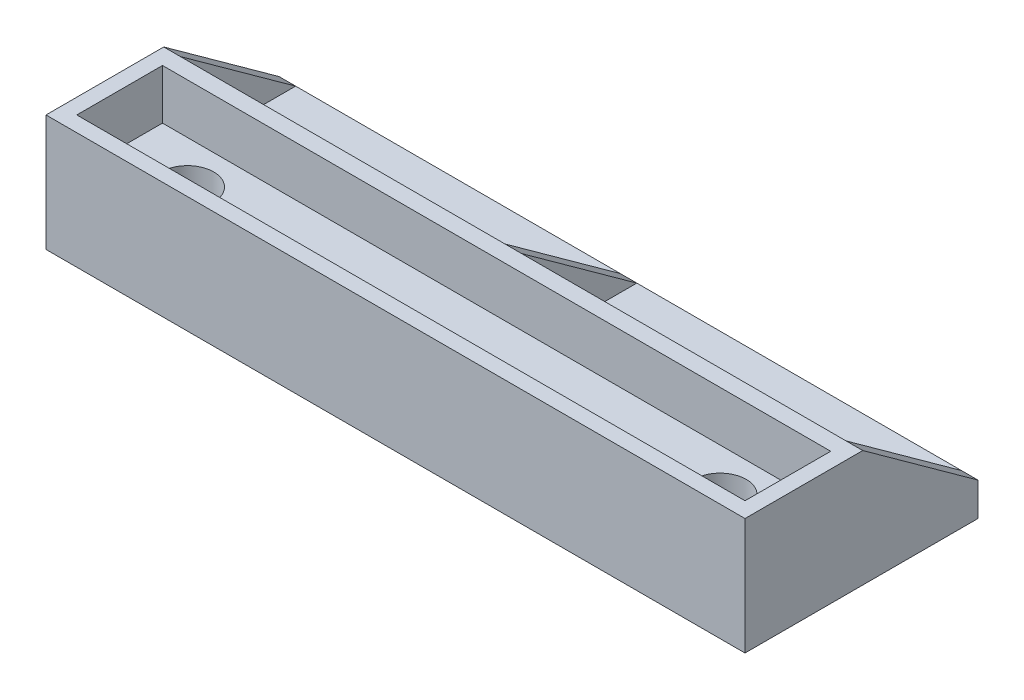
ISO-10303-21;
HEADER;
FILE_DESCRIPTION(('STEP AP214'),'2;1');
FILE_NAME('part.step','',(''),(''),'','','');
FILE_SCHEMA(('AUTOMOTIVE_DESIGN { 1 0 10303 214 1 1 1 1 }'));
ENDSEC;
DATA;
#1=APPLICATION_CONTEXT('core data for automotive mechanical design processes');
#2=APPLICATION_PROTOCOL_DEFINITION('international standard','automotive_design',2000,#1);
#3=PRODUCT_CONTEXT('',#1,'mechanical');
#4=PRODUCT('Part','Part','',(#3));
#5=PRODUCT_RELATED_PRODUCT_CATEGORY('part','',(#4));
#6=PRODUCT_DEFINITION_FORMATION('','',#4);
#7=PRODUCT_DEFINITION_CONTEXT('part definition',#1,'design');
#8=PRODUCT_DEFINITION('design','',#6,#7);
#9=PRODUCT_DEFINITION_SHAPE('','',#8);
#10=(LENGTH_UNIT() NAMED_UNIT(*) SI_UNIT(.MILLI.,.METRE.));
#11=(NAMED_UNIT(*) PLANE_ANGLE_UNIT() SI_UNIT($,.RADIAN.));
#12=(NAMED_UNIT(*) SI_UNIT($,.STERADIAN.) SOLID_ANGLE_UNIT());
#13=UNCERTAINTY_MEASURE_WITH_UNIT(LENGTH_MEASURE(1.E-05),#10,'distance_accuracy_value','');
#14=(GEOMETRIC_REPRESENTATION_CONTEXT(3) GLOBAL_UNCERTAINTY_ASSIGNED_CONTEXT((#13)) GLOBAL_UNIT_ASSIGNED_CONTEXT((#10,
#11,#12)) REPRESENTATION_CONTEXT('',''));
#15=CARTESIAN_POINT('',(0.,0.,0.));
#16=DIRECTION('',(0.,0.,1.));
#17=DIRECTION('',(1.,0.,0.));
#18=AXIS2_PLACEMENT_3D('',#15,#16,#17);
#19=CARTESIAN_POINT('',(5.,7.,-3.49999999993633));
#20=DIRECTION('',(0.,-1.,0.));
#21=DIRECTION('',(0.,0.,-1.));
#22=AXIS2_PLACEMENT_3D('',#19,#20,#21);
#23=CYLINDRICAL_SURFACE('',#22,1.575);
#24=CARTESIAN_POINT('',(5.,0.,-3.49999999993633));
#25=DIRECTION('',(0.,-1.,0.));
#26=DIRECTION('',(0.,0.,1.));
#27=AXIS2_PLACEMENT_3D('',#24,#25,#26);
#28=CIRCLE('',#27,1.575);
#29=CARTESIAN_POINT('',(5.,0.,-1.92499999993633));
#30=VERTEX_POINT('',#29);
#31=EDGE_CURVE('E250',#30,#30,#28,.T.);
#32=ORIENTED_EDGE('',*,*,#31,.T.);
#33=EDGE_LOOP('',(#32));
#34=FACE_BOUND('',#33,.T.);
#35=CARTESIAN_POINT('',(5.,4.,-3.49999999993633));
#36=DIRECTION('',(0.,1.,0.));
#37=DIRECTION('',(0.,0.,1.));
#38=AXIS2_PLACEMENT_3D('',#35,#36,#37);
#39=CIRCLE('',#38,1.575);
#40=CARTESIAN_POINT('',(5.,4.,-1.92499999993633));
#41=VERTEX_POINT('',#40);
#42=EDGE_CURVE('E246',#41,#41,#39,.F.);
#43=ORIENTED_EDGE('',*,*,#42,.F.);
#44=EDGE_LOOP('',(#43));
#45=FACE_BOUND('',#44,.T.);
#46=ADVANCED_FACE('F45',(#34,#45),#23,.F.);
#47=CARTESIAN_POINT('',(37.,7.,-3.49999999993633));
#48=DIRECTION('',(0.,-1.,0.));
#49=DIRECTION('',(0.,0.,-1.));
#50=AXIS2_PLACEMENT_3D('',#47,#48,#49);
#51=CYLINDRICAL_SURFACE('',#50,1.575);
#52=CARTESIAN_POINT('',(37.,0.,-3.49999999993633));
#53=DIRECTION('',(0.,-1.,0.));
#54=DIRECTION('',(0.,0.,-1.));
#55=AXIS2_PLACEMENT_3D('',#52,#53,#54);
#56=CIRCLE('',#55,1.575);
#57=CARTESIAN_POINT('',(37.,0.,-5.07499999993633));
#58=VERTEX_POINT('',#57);
#59=EDGE_CURVE('E251',#58,#58,#56,.T.);
#60=ORIENTED_EDGE('',*,*,#59,.T.);
#61=EDGE_LOOP('',(#60));
#62=FACE_BOUND('',#61,.T.);
#63=CARTESIAN_POINT('',(37.,4.,-3.49999999993633));
#64=DIRECTION('',(0.,1.,0.));
#65=DIRECTION('',(0.,0.,1.));
#66=AXIS2_PLACEMENT_3D('',#63,#64,#65);
#67=CIRCLE('',#66,1.575);
#68=CARTESIAN_POINT('',(37.,4.,-1.92499999993633));
#69=VERTEX_POINT('',#68);
#70=EDGE_CURVE('E236',#69,#69,#67,.F.);
#71=ORIENTED_EDGE('',*,*,#70,.F.);
#72=EDGE_LOOP('',(#71));
#73=FACE_BOUND('',#72,.T.);
#74=ADVANCED_FACE('F414',(#62,#73),#51,.F.);
#75=CARTESIAN_POINT('',(42.,7.,-6.99999999987266));
#76=DIRECTION('',(-1.,0.,0.));
#77=DIRECTION('',(0.,0.,1.));
#78=AXIS2_PLACEMENT_3D('',#75,#76,#77);
#79=PLANE('',#78);
#80=DIRECTION('',(0.,-1.,0.));
#81=VECTOR('',#80,1.);
#82=CARTESIAN_POINT('',(42.,7.,-13.9999999998727));
#83=LINE('',#82,#81);
#84=CARTESIAN_POINT('',(42.,2.,-13.9999999998727));
#85=VERTEX_POINT('',#84);
#86=CARTESIAN_POINT('',(42.,0.,-13.9999999998727));
#87=VERTEX_POINT('',#86);
#88=EDGE_CURVE('E194',#85,#87,#83,.T.);
#89=ORIENTED_EDGE('',*,*,#88,.F.);
#90=DIRECTION('',(0.,0.585383683581828,0.810756401760831));
#91=VECTOR('',#90,1.);
#92=CARTESIAN_POINT('',(42.,7.,-7.07499999987266));
#93=LINE('',#92,#91);
#94=CARTESIAN_POINT('',(42.,7.,-7.07499999987266));
#95=VERTEX_POINT('',#94);
#96=EDGE_CURVE('E177',#85,#95,#93,.T.);
#97=ORIENTED_EDGE('',*,*,#96,.T.);
#98=DIRECTION('',(0.,0.,-1.));
#99=VECTOR('',#98,1.);
#100=CARTESIAN_POINT('',(42.,7.,-6.99999999987266));
#101=LINE('',#100,#99);
#102=CARTESIAN_POINT('',(42.,7.,0.));
#103=VERTEX_POINT('',#102);
#104=EDGE_CURVE('E259',#103,#95,#101,.T.);
#105=ORIENTED_EDGE('',*,*,#104,.F.);
#106=DIRECTION('',(0.,-1.,0.));
#107=VECTOR('',#106,1.);
#108=CARTESIAN_POINT('',(42.,7.,0.));
#109=LINE('',#108,#107);
#110=CARTESIAN_POINT('',(42.,0.,0.));
#111=VERTEX_POINT('',#110);
#112=EDGE_CURVE('E269',#103,#111,#109,.T.);
#113=ORIENTED_EDGE('',*,*,#112,.T.);
#114=DIRECTION('',(0.,0.,-1.));
#115=VECTOR('',#114,1.);
#116=CARTESIAN_POINT('',(42.,0.,-6.99999999987266));
#117=LINE('',#116,#115);
#118=EDGE_CURVE('E255',#111,#87,#117,.T.);
#119=ORIENTED_EDGE('',*,*,#118,.T.);
#120=EDGE_LOOP('',(#89,#97,#105,#113,#119));
#121=FACE_BOUND('',#120,.T.);
#122=ADVANCED_FACE('F383',(#121),#79,.F.);
#123=CARTESIAN_POINT('',(0.,7.,-6.99999999987266));
#124=DIRECTION('',(1.,0.,0.));
#125=DIRECTION('',(0.,0.,-1.));
#126=AXIS2_PLACEMENT_3D('',#123,#124,#125);
#127=PLANE('',#126);
#128=DIRECTION('',(0.,0.,1.));
#129=VECTOR('',#128,1.);
#130=CARTESIAN_POINT('',(0.,7.,-6.99999999987266));
#131=LINE('',#130,#129);
#132=CARTESIAN_POINT('',(0.,7.,-7.07499999987266));
#133=VERTEX_POINT('',#132);
#134=CARTESIAN_POINT('',(0.,7.,0.));
#135=VERTEX_POINT('',#134);
#136=EDGE_CURVE('E186',#133,#135,#131,.T.);
#137=ORIENTED_EDGE('',*,*,#136,.F.);
#138=DIRECTION('',(0.,0.585383683581828,0.810756401760831));
#139=VECTOR('',#138,1.);
#140=CARTESIAN_POINT('',(0.,7.,-7.07499999987266));
#141=LINE('',#140,#139);
#142=CARTESIAN_POINT('',(0.,2.,-13.9999999998727));
#143=VERTEX_POINT('',#142);
#144=EDGE_CURVE('E167',#143,#133,#141,.T.);
#145=ORIENTED_EDGE('',*,*,#144,.F.);
#146=DIRECTION('',(0.,-1.,0.));
#147=VECTOR('',#146,1.);
#148=CARTESIAN_POINT('',(0.,7.,-13.9999999998727));
#149=LINE('',#148,#147);
#150=CARTESIAN_POINT('',(0.,0.,-13.9999999998727));
#151=VERTEX_POINT('',#150);
#152=EDGE_CURVE('E183',#143,#151,#149,.T.);
#153=ORIENTED_EDGE('',*,*,#152,.T.);
#154=DIRECTION('',(0.,0.,1.));
#155=VECTOR('',#154,1.);
#156=CARTESIAN_POINT('',(0.,0.,-6.99999999987266));
#157=LINE('',#156,#155);
#158=CARTESIAN_POINT('',(0.,0.,0.));
#159=VERTEX_POINT('',#158);
#160=EDGE_CURVE('E273',#151,#159,#157,.T.);
#161=ORIENTED_EDGE('',*,*,#160,.T.);
#162=DIRECTION('',(0.,-1.,0.));
#163=VECTOR('',#162,1.);
#164=CARTESIAN_POINT('',(0.,7.,0.));
#165=LINE('',#164,#163);
#166=EDGE_CURVE('E281',#135,#159,#165,.T.);
#167=ORIENTED_EDGE('',*,*,#166,.F.);
#168=EDGE_LOOP('',(#137,#145,#153,#161,#167));
#169=FACE_BOUND('',#168,.T.);
#170=ADVANCED_FACE('F182',(#169),#127,.F.);
#171=CARTESIAN_POINT('',(0.,7.,0.));
#172=DIRECTION('',(0.,0.,-1.));
#173=DIRECTION('',(-1.,0.,0.));
#174=AXIS2_PLACEMENT_3D('',#171,#172,#173);
#175=PLANE('',#174);
#176=DIRECTION('',(1.,0.,0.));
#177=VECTOR('',#176,1.);
#178=CARTESIAN_POINT('',(0.,0.,0.));
#179=LINE('',#178,#177);
#180=EDGE_CURVE('E263',#159,#111,#179,.T.);
#181=ORIENTED_EDGE('',*,*,#180,.T.);
#182=ORIENTED_EDGE('',*,*,#112,.F.);
#183=DIRECTION('',(1.,0.,0.));
#184=VECTOR('',#183,1.);
#185=CARTESIAN_POINT('',(0.,7.,0.));
#186=LINE('',#185,#184);
#187=EDGE_CURVE('E266',#135,#103,#186,.T.);
#188=ORIENTED_EDGE('',*,*,#187,.F.);
#189=ORIENTED_EDGE('',*,*,#166,.T.);
#190=EDGE_LOOP('',(#181,#182,#188,#189));
#191=FACE_BOUND('',#190,.T.);
#192=ADVANCED_FACE('F393',(#191),#175,.F.);
#193=CARTESIAN_POINT('',(0.,7.,0.));
#194=DIRECTION('',(0.,1.,0.));
#195=DIRECTION('',(0.,0.,1.));
#196=AXIS2_PLACEMENT_3D('',#193,#194,#195);
#197=PLANE('',#196);
#198=DIRECTION('',(-1.,0.,0.));
#199=VECTOR('',#198,1.);
#200=CARTESIAN_POINT('',(42.,7.,-7.07499999987266));
#201=LINE('',#200,#199);
#202=CARTESIAN_POINT('',(1.,7.,-7.07499999987266));
#203=VERTEX_POINT('',#202);
#204=EDGE_CURVE('E373',#203,#133,#201,.T.);
#205=ORIENTED_EDGE('',*,*,#204,.T.);
#206=ORIENTED_EDGE('',*,*,#136,.T.);
#207=ORIENTED_EDGE('',*,*,#187,.T.);
#208=ORIENTED_EDGE('',*,*,#104,.T.);
#209=CARTESIAN_POINT('',(41.,7.,-7.07499999987266));
#210=VERTEX_POINT('',#209);
#211=EDGE_CURVE('E370',#95,#210,#201,.T.);
#212=ORIENTED_EDGE('',*,*,#211,.T.);
#213=DIRECTION('',(1.,0.,0.));
#214=VECTOR('',#213,1.);
#215=CARTESIAN_POINT('',(21.5,7.,-7.07499999987266));
#216=LINE('',#215,#214);
#217=CARTESIAN_POINT('',(21.5,7.,-7.07499999987266));
#218=VERTEX_POINT('',#217);
#219=EDGE_CURVE('E328',#218,#210,#216,.T.);
#220=ORIENTED_EDGE('',*,*,#219,.F.);
#221=CARTESIAN_POINT('',(20.5,7.,-7.07499999987266));
#222=VERTEX_POINT('',#221);
#223=EDGE_CURVE('E377',#218,#222,#201,.T.);
#224=ORIENTED_EDGE('',*,*,#223,.T.);
#225=DIRECTION('',(1.,0.,0.));
#226=VECTOR('',#225,1.);
#227=CARTESIAN_POINT('',(20.5,7.,-7.07499999987266));
#228=LINE('',#227,#226);
#229=EDGE_CURVE('E335',#203,#222,#228,.T.);
#230=ORIENTED_EDGE('',*,*,#229,.F.);
#231=EDGE_LOOP('',(#205,#206,#207,#208,#212,#220,#224,#230));
#232=FACE_BOUND('',#231,.T.);
#233=DIRECTION('',(0.,0.,1.));
#234=VECTOR('',#233,1.);
#235=CARTESIAN_POINT('',(0.925,7.,-6.07499999987266));
#236=LINE('',#235,#234);
#237=CARTESIAN_POINT('',(0.925,7.,-6.07499999987266));
#238=VERTEX_POINT('',#237);
#239=CARTESIAN_POINT('',(0.925000000000001,7.,-0.924999999872661));
#240=VERTEX_POINT('',#239);
#241=EDGE_CURVE('E198',#238,#240,#236,.T.);
#242=ORIENTED_EDGE('',*,*,#241,.F.);
#243=DIRECTION('',(1.,0.,0.));
#244=VECTOR('',#243,1.);
#245=CARTESIAN_POINT('',(0.925,7.,-6.07499999987266));
#246=LINE('',#245,#244);
#247=CARTESIAN_POINT('',(41.075,7.,-6.07499999987266));
#248=VERTEX_POINT('',#247);
#249=EDGE_CURVE('E209',#238,#248,#246,.T.);
#250=ORIENTED_EDGE('',*,*,#249,.T.);
#251=DIRECTION('',(0.,0.,1.));
#252=VECTOR('',#251,1.);
#253=CARTESIAN_POINT('',(41.075,7.,-6.07499999987266));
#254=LINE('',#253,#252);
#255=CARTESIAN_POINT('',(41.075,7.,-0.924999999872661));
#256=VERTEX_POINT('',#255);
#257=EDGE_CURVE('E226',#248,#256,#254,.T.);
#258=ORIENTED_EDGE('',*,*,#257,.T.);
#259=DIRECTION('',(1.,0.,0.));
#260=VECTOR('',#259,1.);
#261=CARTESIAN_POINT('',(0.925000000000001,7.,-0.924999999872661));
#262=LINE('',#261,#260);
#263=EDGE_CURVE('E222',#240,#256,#262,.T.);
#264=ORIENTED_EDGE('',*,*,#263,.F.);
#265=EDGE_LOOP('',(#242,#250,#258,#264));
#266=FACE_BOUND('',#265,.T.);
#267=ADVANCED_FACE('F387',(#232,#266),#197,.T.);
#268=CARTESIAN_POINT('',(0.,0.,0.));
#269=DIRECTION('',(0.,1.,0.));
#270=DIRECTION('',(0.,0.,1.));
#271=AXIS2_PLACEMENT_3D('',#268,#269,#270);
#272=PLANE('',#271);
#273=ORIENTED_EDGE('',*,*,#59,.F.);
#274=EDGE_LOOP('',(#273));
#275=FACE_BOUND('',#274,.T.);
#276=ORIENTED_EDGE('',*,*,#31,.F.);
#277=EDGE_LOOP('',(#276));
#278=FACE_BOUND('',#277,.T.);
#279=ORIENTED_EDGE('',*,*,#118,.F.);
#280=ORIENTED_EDGE('',*,*,#180,.F.);
#281=ORIENTED_EDGE('',*,*,#160,.F.);
#282=DIRECTION('',(-1.,0.,0.));
#283=VECTOR('',#282,1.);
#284=CARTESIAN_POINT('',(42.,0.,-13.9999999998727));
#285=LINE('',#284,#283);
#286=EDGE_CURVE('E192',#87,#151,#285,.T.);
#287=ORIENTED_EDGE('',*,*,#286,.F.);
#288=EDGE_LOOP('',(#279,#280,#281,#287));
#289=FACE_BOUND('',#288,.T.);
#290=ADVANCED_FACE('F397',(#275,#278,#289),#272,.F.);
#291=CARTESIAN_POINT('',(0.,4.,0.));
#292=DIRECTION('',(0.,1.,0.));
#293=DIRECTION('',(0.,0.,1.));
#294=AXIS2_PLACEMENT_3D('',#291,#292,#293);
#295=PLANE('',#294);
#296=DIRECTION('',(0.,0.,1.));
#297=VECTOR('',#296,1.);
#298=CARTESIAN_POINT('',(0.925,4.,-6.07499999987266));
#299=LINE('',#298,#297);
#300=CARTESIAN_POINT('',(0.925,4.,-6.07499999987266));
#301=VERTEX_POINT('',#300);
#302=CARTESIAN_POINT('',(0.925000000000001,4.,-0.924999999872661));
#303=VERTEX_POINT('',#302);
#304=EDGE_CURVE('E204',#301,#303,#299,.T.);
#305=ORIENTED_EDGE('',*,*,#304,.T.);
#306=DIRECTION('',(1.,0.,0.));
#307=VECTOR('',#306,1.);
#308=CARTESIAN_POINT('',(0.925000000000001,4.,-0.924999999872661));
#309=LINE('',#308,#307);
#310=CARTESIAN_POINT('',(41.075,4.,-0.924999999872661));
#311=VERTEX_POINT('',#310);
#312=EDGE_CURVE('E208',#303,#311,#309,.T.);
#313=ORIENTED_EDGE('',*,*,#312,.T.);
#314=DIRECTION('',(0.,0.,1.));
#315=VECTOR('',#314,1.);
#316=CARTESIAN_POINT('',(41.075,4.,-6.07499999987266));
#317=LINE('',#316,#315);
#318=CARTESIAN_POINT('',(41.075,4.,-6.07499999987266));
#319=VERTEX_POINT('',#318);
#320=EDGE_CURVE('E213',#319,#311,#317,.T.);
#321=ORIENTED_EDGE('',*,*,#320,.F.);
#322=DIRECTION('',(1.,0.,0.));
#323=VECTOR('',#322,1.);
#324=CARTESIAN_POINT('',(0.925,4.,-6.07499999987266));
#325=LINE('',#324,#323);
#326=EDGE_CURVE('E216',#301,#319,#325,.T.);
#327=ORIENTED_EDGE('',*,*,#326,.F.);
#328=EDGE_LOOP('',(#305,#313,#321,#327));
#329=FACE_BOUND('',#328,.T.);
#330=ORIENTED_EDGE('',*,*,#70,.T.);
#331=EDGE_LOOP('',(#330));
#332=FACE_BOUND('',#331,.T.);
#333=ORIENTED_EDGE('',*,*,#42,.T.);
#334=EDGE_LOOP('',(#333));
#335=FACE_BOUND('',#334,.T.);
#336=ADVANCED_FACE('F399',(#329,#332,#335),#295,.T.);
#337=CARTESIAN_POINT('',(0.925,4.,-6.07499999987266));
#338=DIRECTION('',(-1.,0.,0.));
#339=DIRECTION('',(0.,0.,1.));
#340=AXIS2_PLACEMENT_3D('',#337,#338,#339);
#341=PLANE('',#340);
#342=ORIENTED_EDGE('',*,*,#241,.T.);
#343=DIRECTION('',(0.,1.,0.));
#344=VECTOR('',#343,1.);
#345=CARTESIAN_POINT('',(0.925000000000001,4.,-0.924999999872661));
#346=LINE('',#345,#344);
#347=EDGE_CURVE('E219',#303,#240,#346,.T.);
#348=ORIENTED_EDGE('',*,*,#347,.F.);
#349=ORIENTED_EDGE('',*,*,#304,.F.);
#350=DIRECTION('',(0.,1.,0.));
#351=VECTOR('',#350,1.);
#352=CARTESIAN_POINT('',(0.925,4.,-6.07499999987266));
#353=LINE('',#352,#351);
#354=EDGE_CURVE('E233',#301,#238,#353,.T.);
#355=ORIENTED_EDGE('',*,*,#354,.T.);
#356=EDGE_LOOP('',(#342,#348,#349,#355));
#357=FACE_BOUND('',#356,.T.);
#358=ADVANCED_FACE('F406',(#357),#341,.F.);
#359=CARTESIAN_POINT('',(0.925,4.,-6.07499999987266));
#360=DIRECTION('',(0.,0.,1.));
#361=DIRECTION('',(1.,0.,0.));
#362=AXIS2_PLACEMENT_3D('',#359,#360,#361);
#363=PLANE('',#362);
#364=ORIENTED_EDGE('',*,*,#249,.F.);
#365=ORIENTED_EDGE('',*,*,#354,.F.);
#366=ORIENTED_EDGE('',*,*,#326,.T.);
#367=DIRECTION('',(0.,1.,0.));
#368=VECTOR('',#367,1.);
#369=CARTESIAN_POINT('',(41.075,4.,-6.07499999987266));
#370=LINE('',#369,#368);
#371=EDGE_CURVE('E237',#319,#248,#370,.T.);
#372=ORIENTED_EDGE('',*,*,#371,.T.);
#373=EDGE_LOOP('',(#364,#365,#366,#372));
#374=FACE_BOUND('',#373,.T.);
#375=ADVANCED_FACE('F426',(#374),#363,.T.);
#376=CARTESIAN_POINT('',(41.075,4.,-6.07499999987266));
#377=DIRECTION('',(-1.,0.,0.));
#378=DIRECTION('',(0.,0.,1.));
#379=AXIS2_PLACEMENT_3D('',#376,#377,#378);
#380=PLANE('',#379);
#381=ORIENTED_EDGE('',*,*,#257,.F.);
#382=ORIENTED_EDGE('',*,*,#371,.F.);
#383=ORIENTED_EDGE('',*,*,#320,.T.);
#384=DIRECTION('',(0.,1.,0.));
#385=VECTOR('',#384,1.);
#386=CARTESIAN_POINT('',(41.075,4.,-0.924999999872661));
#387=LINE('',#386,#385);
#388=EDGE_CURVE('E240',#311,#256,#387,.T.);
#389=ORIENTED_EDGE('',*,*,#388,.T.);
#390=EDGE_LOOP('',(#381,#382,#383,#389));
#391=FACE_BOUND('',#390,.T.);
#392=ADVANCED_FACE('F431',(#391),#380,.T.);
#393=CARTESIAN_POINT('',(0.925000000000001,4.,-0.924999999872661));
#394=DIRECTION('',(0.,0.,1.));
#395=DIRECTION('',(1.,0.,0.));
#396=AXIS2_PLACEMENT_3D('',#393,#394,#395);
#397=PLANE('',#396);
#398=ORIENTED_EDGE('',*,*,#263,.T.);
#399=ORIENTED_EDGE('',*,*,#388,.F.);
#400=ORIENTED_EDGE('',*,*,#312,.F.);
#401=ORIENTED_EDGE('',*,*,#347,.T.);
#402=EDGE_LOOP('',(#398,#399,#400,#401));
#403=FACE_BOUND('',#402,.T.);
#404=ADVANCED_FACE('F428',(#403),#397,.F.);
#405=CARTESIAN_POINT('',(42.,7.,-13.9999999998727));
#406=DIRECTION('',(0.,0.,1.));
#407=DIRECTION('',(1.,0.,0.));
#408=AXIS2_PLACEMENT_3D('',#405,#406,#407);
#409=PLANE('',#408);
#410=ORIENTED_EDGE('',*,*,#152,.F.);
#411=DIRECTION('',(-1.,0.,0.));
#412=VECTOR('',#411,1.);
#413=CARTESIAN_POINT('',(42.,2.,-13.9999999998727));
#414=LINE('',#413,#412);
#415=CARTESIAN_POINT('',(1.,2.,-13.9999999998727));
#416=VERTEX_POINT('',#415);
#417=EDGE_CURVE('E163',#416,#143,#414,.T.);
#418=ORIENTED_EDGE('',*,*,#417,.F.);
#419=DIRECTION('',(-1.,0.,0.));
#420=VECTOR('',#419,1.);
#421=CARTESIAN_POINT('',(1.,2.,-13.9999999998727));
#422=LINE('',#421,#420);
#423=CARTESIAN_POINT('',(20.5,2.,-13.9999999998727));
#424=VERTEX_POINT('',#423);
#425=EDGE_CURVE('E355',#424,#416,#422,.T.);
#426=ORIENTED_EDGE('',*,*,#425,.F.);
#427=CARTESIAN_POINT('',(21.5,2.,-13.9999999998727));
#428=VERTEX_POINT('',#427);
#429=EDGE_CURVE('E176',#428,#424,#414,.T.);
#430=ORIENTED_EDGE('',*,*,#429,.F.);
#431=DIRECTION('',(-1.,0.,0.));
#432=VECTOR('',#431,1.);
#433=CARTESIAN_POINT('',(21.5,2.,-13.9999999998727));
#434=LINE('',#433,#432);
#435=CARTESIAN_POINT('',(41.,2.,-13.9999999998727));
#436=VERTEX_POINT('',#435);
#437=EDGE_CURVE('E324',#436,#428,#434,.T.);
#438=ORIENTED_EDGE('',*,*,#437,.F.);
#439=EDGE_CURVE('E179',#85,#436,#414,.T.);
#440=ORIENTED_EDGE('',*,*,#439,.F.);
#441=ORIENTED_EDGE('',*,*,#88,.T.);
#442=ORIENTED_EDGE('',*,*,#286,.T.);
#443=EDGE_LOOP('',(#410,#418,#426,#430,#438,#440,#441,#442));
#444=FACE_BOUND('',#443,.T.);
#445=ADVANCED_FACE('F190',(#444),#409,.F.);
#446=CARTESIAN_POINT('',(21.5,2.,-13.9999999998727));
#447=DIRECTION('',(-1.,0.,0.));
#448=DIRECTION('',(0.,0.,1.));
#449=AXIS2_PLACEMENT_3D('',#446,#447,#448);
#450=PLANE('',#449);
#451=DIRECTION('',(0.,1.,0.));
#452=VECTOR('',#451,1.);
#453=CARTESIAN_POINT('',(21.5,2.,-7.07499999987266));
#454=LINE('',#453,#452);
#455=CARTESIAN_POINT('',(21.5,2.99999999999999,-7.07499999987266));
#456=VERTEX_POINT('',#455);
#457=EDGE_CURVE('E329',#456,#218,#454,.T.);
#458=ORIENTED_EDGE('',*,*,#457,.F.);
#459=DIRECTION('',(0.,-0.707106781186543,-0.707106781186552));
#460=VECTOR('',#459,1.);
#461=CARTESIAN_POINT('',(21.5,2.,-8.07499999987267));
#462=LINE('',#461,#460);
#463=CARTESIAN_POINT('',(21.5,2.,-8.07499999987267));
#464=VERTEX_POINT('',#463);
#465=EDGE_CURVE('E11',#456,#464,#462,.T.);
#466=ORIENTED_EDGE('',*,*,#465,.T.);
#467=DIRECTION('',(0.,0.,1.));
#468=VECTOR('',#467,1.);
#469=CARTESIAN_POINT('',(21.5,2.,-13.9999999998727));
#470=LINE('',#469,#468);
#471=EDGE_CURVE('E315',#428,#464,#470,.T.);
#472=ORIENTED_EDGE('',*,*,#471,.F.);
#473=DIRECTION('',(0.,0.585383683581828,0.810756401760831));
#474=VECTOR('',#473,1.);
#475=CARTESIAN_POINT('',(21.5,2.,-13.9999999998727));
#476=LINE('',#475,#474);
#477=EDGE_CURVE('E339',#428,#218,#476,.T.);
#478=ORIENTED_EDGE('',*,*,#477,.T.);
#479=EDGE_LOOP('',(#458,#466,#472,#478));
#480=FACE_BOUND('',#479,.T.);
#481=ADVANCED_FACE('F441',(#480),#450,.F.);
#482=CARTESIAN_POINT('',(41.,2.,-13.9999999998727));
#483=DIRECTION('',(1.,0.,0.));
#484=DIRECTION('',(0.,0.,-1.));
#485=AXIS2_PLACEMENT_3D('',#482,#483,#484);
#486=PLANE('',#485);
#487=DIRECTION('',(0.,0.,-1.));
#488=VECTOR('',#487,1.);
#489=CARTESIAN_POINT('',(41.,2.,-13.9999999998727));
#490=LINE('',#489,#488);
#491=CARTESIAN_POINT('',(41.,2.,-8.07499999987267));
#492=VERTEX_POINT('',#491);
#493=EDGE_CURVE('E312',#492,#436,#490,.T.);
#494=ORIENTED_EDGE('',*,*,#493,.F.);
#495=DIRECTION('',(0.,0.707106781186543,0.707106781186552));
#496=VECTOR('',#495,1.);
#497=CARTESIAN_POINT('',(41.,2.,-8.07499999987267));
#498=LINE('',#497,#496);
#499=CARTESIAN_POINT('',(41.,2.99999999999999,-7.07499999987266));
#500=VERTEX_POINT('',#499);
#501=EDGE_CURVE('E69',#492,#500,#498,.T.);
#502=ORIENTED_EDGE('',*,*,#501,.T.);
#503=DIRECTION('',(0.,1.,0.));
#504=VECTOR('',#503,1.);
#505=CARTESIAN_POINT('',(41.,2.,-7.07499999987266));
#506=LINE('',#505,#504);
#507=EDGE_CURVE('E336',#500,#210,#506,.T.);
#508=ORIENTED_EDGE('',*,*,#507,.T.);
#509=DIRECTION('',(0.,-0.585383683581828,-0.810756401760831));
#510=VECTOR('',#509,1.);
#511=CARTESIAN_POINT('',(41.,2.,-13.9999999998727));
#512=LINE('',#511,#510);
#513=EDGE_CURVE('E321',#210,#436,#512,.T.);
#514=ORIENTED_EDGE('',*,*,#513,.T.);
#515=EDGE_LOOP('',(#494,#502,#508,#514));
#516=FACE_BOUND('',#515,.T.);
#517=ADVANCED_FACE('F319',(#516),#486,.F.);
#518=CARTESIAN_POINT('',(21.5,2.,-7.07499999987266));
#519=DIRECTION('',(0.,0.,1.));
#520=DIRECTION('',(1.,0.,0.));
#521=AXIS2_PLACEMENT_3D('',#518,#519,#520);
#522=PLANE('',#521);
#523=ORIENTED_EDGE('',*,*,#507,.F.);
#524=DIRECTION('',(-1.,0.,0.));
#525=VECTOR('',#524,1.);
#526=CARTESIAN_POINT('',(21.5,2.99999999999999,-7.07499999987266));
#527=LINE('',#526,#525);
#528=EDGE_CURVE('E55',#500,#456,#527,.T.);
#529=ORIENTED_EDGE('',*,*,#528,.T.);
#530=ORIENTED_EDGE('',*,*,#457,.T.);
#531=ORIENTED_EDGE('',*,*,#219,.T.);
#532=EDGE_LOOP('',(#523,#529,#530,#531));
#533=FACE_BOUND('',#532,.T.);
#534=ADVANCED_FACE('F445',(#533),#522,.F.);
#535=CARTESIAN_POINT('',(0.,2.,0.));
#536=DIRECTION('',(0.,1.,0.));
#537=DIRECTION('',(0.,0.,1.));
#538=AXIS2_PLACEMENT_3D('',#535,#536,#537);
#539=PLANE('',#538);
#540=ORIENTED_EDGE('',*,*,#471,.T.);
#541=DIRECTION('',(1.,0.,0.));
#542=VECTOR('',#541,1.);
#543=CARTESIAN_POINT('',(0.,2.,-8.07499999987267));
#544=LINE('',#543,#542);
#545=EDGE_CURVE('E301',#464,#492,#544,.T.);
#546=ORIENTED_EDGE('',*,*,#545,.T.);
#547=ORIENTED_EDGE('',*,*,#493,.T.);
#548=ORIENTED_EDGE('',*,*,#437,.T.);
#549=EDGE_LOOP('',(#540,#546,#547,#548));
#550=FACE_BOUND('',#549,.T.);
#551=ADVANCED_FACE('F310',(#550),#539,.T.);
#552=CARTESIAN_POINT('',(20.5,2.,-7.07499999987266));
#553=DIRECTION('',(0.,0.,1.));
#554=DIRECTION('',(1.,0.,0.));
#555=AXIS2_PLACEMENT_3D('',#552,#553,#554);
#556=PLANE('',#555);
#557=DIRECTION('',(0.,1.,0.));
#558=VECTOR('',#557,1.);
#559=CARTESIAN_POINT('',(20.5,2.,-7.07499999987266));
#560=LINE('',#559,#558);
#561=CARTESIAN_POINT('',(20.5,2.99999999999999,-7.07499999987266));
#562=VERTEX_POINT('',#561);
#563=EDGE_CURVE('E342',#562,#222,#560,.T.);
#564=ORIENTED_EDGE('',*,*,#563,.F.);
#565=DIRECTION('',(-1.,0.,0.));
#566=VECTOR('',#565,1.);
#567=CARTESIAN_POINT('',(1.,2.99999999999999,-7.07499999987266));
#568=LINE('',#567,#566);
#569=CARTESIAN_POINT('',(1.,2.99999999999999,-7.07499999987266));
#570=VERTEX_POINT('',#569);
#571=EDGE_CURVE('E295',#562,#570,#568,.T.);
#572=ORIENTED_EDGE('',*,*,#571,.T.);
#573=DIRECTION('',(0.,1.,0.));
#574=VECTOR('',#573,1.);
#575=CARTESIAN_POINT('',(1.,2.,-7.07499999987266));
#576=LINE('',#575,#574);
#577=EDGE_CURVE('E200',#570,#203,#576,.T.);
#578=ORIENTED_EDGE('',*,*,#577,.T.);
#579=ORIENTED_EDGE('',*,*,#229,.T.);
#580=EDGE_LOOP('',(#564,#572,#578,#579));
#581=FACE_BOUND('',#580,.T.);
#582=ADVANCED_FACE('F444',(#581),#556,.F.);
#583=CARTESIAN_POINT('',(1.,2.,-7.07499999987266));
#584=DIRECTION('',(-1.,0.,0.));
#585=DIRECTION('',(0.,0.,1.));
#586=AXIS2_PLACEMENT_3D('',#583,#584,#585);
#587=PLANE('',#586);
#588=ORIENTED_EDGE('',*,*,#577,.F.);
#589=DIRECTION('',(0.,0.707106781186543,0.707106781186552));
#590=VECTOR('',#589,1.);
#591=CARTESIAN_POINT('',(1.,2.,-8.07499999987266));
#592=LINE('',#591,#590);
#593=CARTESIAN_POINT('',(1.,2.,-8.07499999987266));
#594=VERTEX_POINT('',#593);
#595=EDGE_CURVE('E298',#570,#594,#592,.F.);
#596=ORIENTED_EDGE('',*,*,#595,.T.);
#597=DIRECTION('',(0.,0.,1.));
#598=VECTOR('',#597,1.);
#599=CARTESIAN_POINT('',(1.,2.,-7.07499999987266));
#600=LINE('',#599,#598);
#601=EDGE_CURVE('E345',#416,#594,#600,.T.);
#602=ORIENTED_EDGE('',*,*,#601,.F.);
#603=DIRECTION('',(0.,0.585383683581828,0.810756401760831));
#604=VECTOR('',#603,1.);
#605=CARTESIAN_POINT('',(1.,5.28662971498086,-9.44801784462418));
#606=LINE('',#605,#604);
#607=EDGE_CURVE('E170',#416,#203,#606,.T.);
#608=ORIENTED_EDGE('',*,*,#607,.T.);
#609=EDGE_LOOP('',(#588,#596,#602,#608));
#610=FACE_BOUND('',#609,.T.);
#611=ADVANCED_FACE('F455',(#610),#587,.F.);
#612=CARTESIAN_POINT('',(20.5,2.,-13.9999999998727));
#613=DIRECTION('',(1.,0.,0.));
#614=DIRECTION('',(0.,0.,-1.));
#615=AXIS2_PLACEMENT_3D('',#612,#613,#614);
#616=PLANE('',#615);
#617=DIRECTION('',(0.,0.,-1.));
#618=VECTOR('',#617,1.);
#619=CARTESIAN_POINT('',(20.5,2.,-13.9999999998727));
#620=LINE('',#619,#618);
#621=CARTESIAN_POINT('',(20.5,2.,-8.07499999987267));
#622=VERTEX_POINT('',#621);
#623=EDGE_CURVE('E351',#622,#424,#620,.T.);
#624=ORIENTED_EDGE('',*,*,#623,.F.);
#625=DIRECTION('',(0.,-0.707106781186543,-0.707106781186552));
#626=VECTOR('',#625,1.);
#627=CARTESIAN_POINT('',(20.5,2.,-8.07499999987267));
#628=LINE('',#627,#626);
#629=EDGE_CURVE('E292',#622,#562,#628,.F.);
#630=ORIENTED_EDGE('',*,*,#629,.T.);
#631=ORIENTED_EDGE('',*,*,#563,.T.);
#632=DIRECTION('',(0.,-0.585383683581828,-0.810756401760831));
#633=VECTOR('',#632,1.);
#634=CARTESIAN_POINT('',(20.5,2.,-13.9999999998727));
#635=LINE('',#634,#633);
#636=EDGE_CURVE('E367',#222,#424,#635,.T.);
#637=ORIENTED_EDGE('',*,*,#636,.T.);
#638=EDGE_LOOP('',(#624,#630,#631,#637));
#639=FACE_BOUND('',#638,.T.);
#640=ADVANCED_FACE('F457',(#639),#616,.F.);
#641=CARTESIAN_POINT('',(0.,2.,0.));
#642=DIRECTION('',(0.,-1.,0.));
#643=DIRECTION('',(0.,0.,-1.));
#644=AXIS2_PLACEMENT_3D('',#641,#642,#643);
#645=PLANE('',#644);
#646=ORIENTED_EDGE('',*,*,#601,.T.);
#647=DIRECTION('',(1.,0.,0.));
#648=VECTOR('',#647,1.);
#649=CARTESIAN_POINT('',(20.5,2.,-8.07499999987267));
#650=LINE('',#649,#648);
#651=EDGE_CURVE('E285',#594,#622,#650,.T.);
#652=ORIENTED_EDGE('',*,*,#651,.T.);
#653=ORIENTED_EDGE('',*,*,#623,.T.);
#654=ORIENTED_EDGE('',*,*,#425,.T.);
#655=EDGE_LOOP('',(#646,#652,#653,#654));
#656=FACE_BOUND('',#655,.T.);
#657=ADVANCED_FACE('F460',(#656),#645,.F.);
#658=CARTESIAN_POINT('',(42.,7.,-7.07499999987266));
#659=DIRECTION('',(0.,-0.810756401760831,0.585383683581828));
#660=DIRECTION('',(0.,-0.585383683581828,-0.810756401760831));
#661=AXIS2_PLACEMENT_3D('',#658,#659,#660);
#662=PLANE('',#661);
#663=ORIENTED_EDGE('',*,*,#429,.T.);
#664=ORIENTED_EDGE('',*,*,#636,.F.);
#665=ORIENTED_EDGE('',*,*,#223,.F.);
#666=ORIENTED_EDGE('',*,*,#477,.F.);
#667=EDGE_LOOP('',(#663,#664,#665,#666));
#668=FACE_BOUND('',#667,.T.);
#669=ADVANCED_FACE('F467',(#668),#662,.F.);
#670=ORIENTED_EDGE('',*,*,#417,.T.);
#671=ORIENTED_EDGE('',*,*,#144,.T.);
#672=ORIENTED_EDGE('',*,*,#204,.F.);
#673=ORIENTED_EDGE('',*,*,#607,.F.);
#674=EDGE_LOOP('',(#670,#671,#672,#673));
#675=FACE_BOUND('',#674,.T.);
#676=ADVANCED_FACE('F165',(#675),#662,.F.);
#677=ORIENTED_EDGE('',*,*,#211,.F.);
#678=ORIENTED_EDGE('',*,*,#96,.F.);
#679=ORIENTED_EDGE('',*,*,#439,.T.);
#680=ORIENTED_EDGE('',*,*,#513,.F.);
#681=EDGE_LOOP('',(#677,#678,#679,#680));
#682=FACE_BOUND('',#681,.T.);
#683=ADVANCED_FACE('F471',(#682),#662,.F.);
#684=CARTESIAN_POINT('',(0.,2.,-8.07499999987266));
#685=DIRECTION('',(0.,0.707106781186552,-0.707106781186543));
#686=DIRECTION('',(-1.,0.,0.));
#687=AXIS2_PLACEMENT_3D('',#684,#685,#686);
#688=PLANE('',#687);
#689=ORIENTED_EDGE('',*,*,#595,.F.);
#690=ORIENTED_EDGE('',*,*,#571,.F.);
#691=ORIENTED_EDGE('',*,*,#629,.F.);
#692=ORIENTED_EDGE('',*,*,#651,.F.);
#693=EDGE_LOOP('',(#689,#690,#691,#692));
#694=FACE_BOUND('',#693,.T.);
#695=ADVANCED_FACE('F477',(#694),#688,.T.);
#696=CARTESIAN_POINT('',(0.,2.,-8.07499999987267));
#697=DIRECTION('',(0.,-0.707106781186552,0.707106781186543));
#698=DIRECTION('',(1.,0.,0.));
#699=AXIS2_PLACEMENT_3D('',#696,#697,#698);
#700=PLANE('',#699);
#701=ORIENTED_EDGE('',*,*,#465,.F.);
#702=ORIENTED_EDGE('',*,*,#528,.F.);
#703=ORIENTED_EDGE('',*,*,#501,.F.);
#704=ORIENTED_EDGE('',*,*,#545,.F.);
#705=EDGE_LOOP('',(#701,#702,#703,#704));
#706=FACE_BOUND('',#705,.T.);
#707=ADVANCED_FACE('F48',(#706),#700,.F.);
#708=CLOSED_SHELL('',(#46,#74,#122,#170,#192,#267,#290,#336,#358,#375,#392,#404,#445,#481,#517,
#534,#551,#582,#611,#640,#657,#669,#676,#683,#695,#707));
#709=MANIFOLD_SOLID_BREP('B2',#708);
#710=ADVANCED_BREP_SHAPE_REPRESENTATION('',(#18,#709),#14);
#711=SHAPE_DEFINITION_REPRESENTATION(#9,#710);
ENDSEC;
END-ISO-10303-21;
